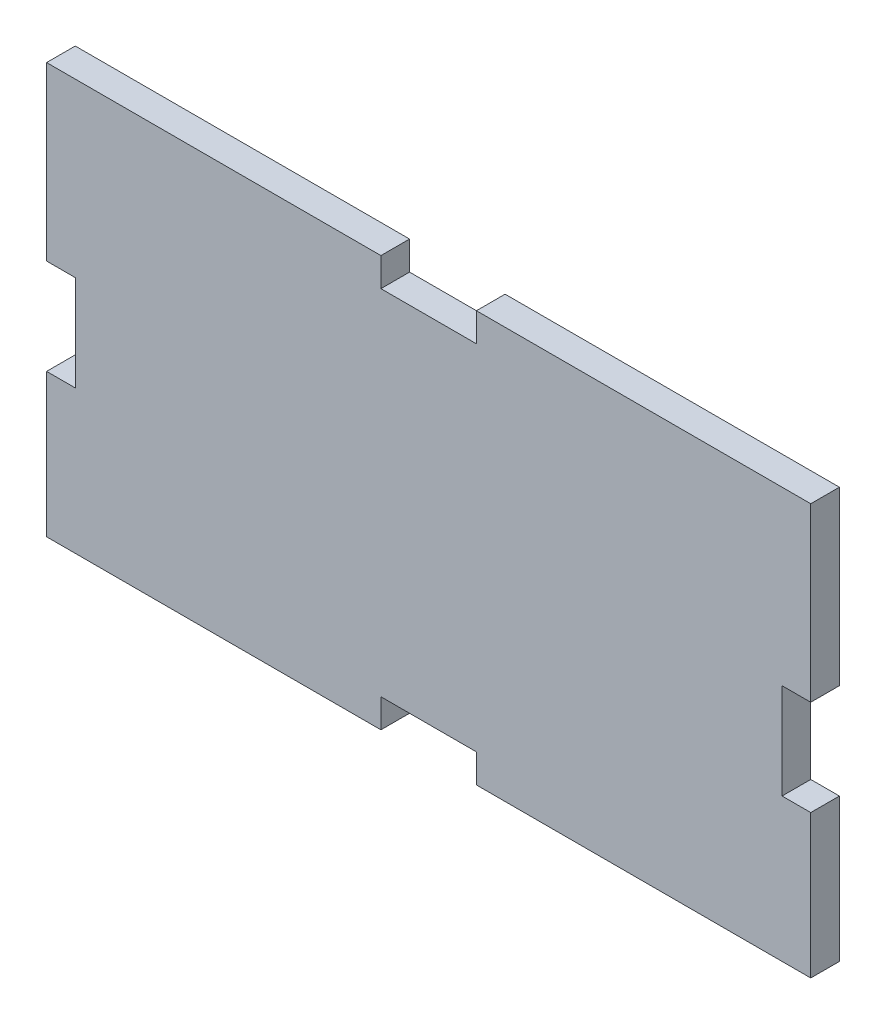
ISO-10303-21;
HEADER;
FILE_DESCRIPTION(('STEP AP214'),'2;1');
FILE_NAME('part.step','',(''),(''),'','','');
FILE_SCHEMA(('AUTOMOTIVE_DESIGN { 1 0 10303 214 1 1 1 1 }'));
ENDSEC;
DATA;
#1=APPLICATION_CONTEXT('core data for automotive mechanical design processes');
#2=APPLICATION_PROTOCOL_DEFINITION('international standard','automotive_design',2000,#1);
#3=PRODUCT_CONTEXT('',#1,'mechanical');
#4=PRODUCT('Part','Part','',(#3));
#5=PRODUCT_RELATED_PRODUCT_CATEGORY('part','',(#4));
#6=PRODUCT_DEFINITION_FORMATION('','',#4);
#7=PRODUCT_DEFINITION_CONTEXT('part definition',#1,'design');
#8=PRODUCT_DEFINITION('design','',#6,#7);
#9=PRODUCT_DEFINITION_SHAPE('','',#8);
#10=(LENGTH_UNIT() NAMED_UNIT(*) SI_UNIT(.MILLI.,.METRE.));
#11=(NAMED_UNIT(*) PLANE_ANGLE_UNIT() SI_UNIT($,.RADIAN.));
#12=(NAMED_UNIT(*) SI_UNIT($,.STERADIAN.) SOLID_ANGLE_UNIT());
#13=UNCERTAINTY_MEASURE_WITH_UNIT(LENGTH_MEASURE(1.E-05),#10,'distance_accuracy_value','');
#14=(GEOMETRIC_REPRESENTATION_CONTEXT(3) GLOBAL_UNCERTAINTY_ASSIGNED_CONTEXT((#13)) GLOBAL_UNIT_ASSIGNED_CONTEXT((#10,
#11,#12)) REPRESENTATION_CONTEXT('',''));
#15=CARTESIAN_POINT('',(0.,0.,0.));
#16=DIRECTION('',(0.,0.,1.));
#17=DIRECTION('',(1.,0.,0.));
#18=AXIS2_PLACEMENT_3D('',#15,#16,#17);
#19=CARTESIAN_POINT('',(-32.6435719058765,-2.13730942666412E-11,3.));
#20=DIRECTION('',(0.,-1.,0.));
#21=DIRECTION('',(0.,0.,-1.));
#22=AXIS2_PLACEMENT_3D('',#19,#20,#21);
#23=PLANE('',#22);
#24=DIRECTION('',(-1.,0.,0.));
#25=VECTOR('',#24,1.);
#26=CARTESIAN_POINT('',(-32.6435719058765,-2.13730942666412E-11,0.));
#27=LINE('',#26,#25);
#28=CARTESIAN_POINT('',(2.35642809412349,-2.13730942666412E-11,0.));
#29=VERTEX_POINT('',#28);
#30=CARTESIAN_POINT('',(-32.6435719058765,-2.13730942666412E-11,0.));
#31=VERTEX_POINT('',#30);
#32=EDGE_CURVE('E205',#29,#31,#27,.T.);
#33=ORIENTED_EDGE('',*,*,#32,.T.);
#34=DIRECTION('',(0.,0.,-1.));
#35=VECTOR('',#34,1.);
#36=CARTESIAN_POINT('',(-32.6435719058765,-2.13730942666412E-11,3.));
#37=LINE('',#36,#35);
#38=CARTESIAN_POINT('',(-32.6435719058765,-2.13730942666412E-11,3.));
#39=VERTEX_POINT('',#38);
#40=EDGE_CURVE('E11',#39,#31,#37,.T.);
#41=ORIENTED_EDGE('',*,*,#40,.F.);
#42=DIRECTION('',(-1.,0.,0.));
#43=VECTOR('',#42,1.);
#44=CARTESIAN_POINT('',(-32.6435719058765,-2.13730942666412E-11,3.));
#45=LINE('',#44,#43);
#46=CARTESIAN_POINT('',(2.35642809412349,-2.13730942666412E-11,3.));
#47=VERTEX_POINT('',#46);
#48=EDGE_CURVE('E244',#47,#39,#45,.T.);
#49=ORIENTED_EDGE('',*,*,#48,.F.);
#50=DIRECTION('',(0.,0.,-1.));
#51=VECTOR('',#50,1.);
#52=CARTESIAN_POINT('',(2.35642809412349,-2.13730942666412E-11,3.));
#53=LINE('',#52,#51);
#54=EDGE_CURVE('E201',#47,#29,#53,.T.);
#55=ORIENTED_EDGE('',*,*,#54,.T.);
#56=EDGE_LOOP('',(#33,#41,#49,#55));
#57=FACE_BOUND('',#56,.T.);
#58=ADVANCED_FACE('F37',(#57),#23,.F.);
#59=CARTESIAN_POINT('',(-32.6435719058765,-2.13730942666412E-11,3.));
#60=DIRECTION('',(1.,0.,0.));
#61=DIRECTION('',(0.,1.,0.));
#62=AXIS2_PLACEMENT_3D('',#59,#60,#61);
#63=PLANE('',#62);
#64=DIRECTION('',(0.,-1.,0.));
#65=VECTOR('',#64,1.);
#66=CARTESIAN_POINT('',(-32.6435719058765,-2.13730942666412E-11,0.));
#67=LINE('',#66,#65);
#68=CARTESIAN_POINT('',(-32.6435719058765,-18.0000000000214,0.));
#69=VERTEX_POINT('',#68);
#70=EDGE_CURVE('E208',#31,#69,#67,.T.);
#71=ORIENTED_EDGE('',*,*,#70,.T.);
#72=DIRECTION('',(0.,0.,-1.));
#73=VECTOR('',#72,1.);
#74=CARTESIAN_POINT('',(-32.6435719058765,-18.0000000000214,3.));
#75=LINE('',#74,#73);
#76=CARTESIAN_POINT('',(-32.6435719058765,-18.0000000000214,3.));
#77=VERTEX_POINT('',#76);
#78=EDGE_CURVE('E45',#77,#69,#75,.T.);
#79=ORIENTED_EDGE('',*,*,#78,.F.);
#80=DIRECTION('',(0.,-1.,0.));
#81=VECTOR('',#80,1.);
#82=CARTESIAN_POINT('',(-32.6435719058765,-2.13730942666412E-11,3.));
#83=LINE('',#82,#81);
#84=EDGE_CURVE('E132',#39,#77,#83,.T.);
#85=ORIENTED_EDGE('',*,*,#84,.F.);
#86=ORIENTED_EDGE('',*,*,#40,.T.);
#87=EDGE_LOOP('',(#71,#79,#85,#86));
#88=FACE_BOUND('',#87,.T.);
#89=ADVANCED_FACE('F361',(#88),#63,.F.);
#90=CARTESIAN_POINT('',(-32.6435719058765,-18.0000000000214,3.));
#91=DIRECTION('',(0.,1.,0.));
#92=DIRECTION('',(0.,0.,1.));
#93=AXIS2_PLACEMENT_3D('',#90,#91,#92);
#94=PLANE('',#93);
#95=DIRECTION('',(1.,0.,0.));
#96=VECTOR('',#95,1.);
#97=CARTESIAN_POINT('',(-32.6435719058765,-18.0000000000214,0.));
#98=LINE('',#97,#96);
#99=CARTESIAN_POINT('',(-29.6435719058765,-18.0000000000214,0.));
#100=VERTEX_POINT('',#99);
#101=EDGE_CURVE('E210',#69,#100,#98,.T.);
#102=ORIENTED_EDGE('',*,*,#101,.T.);
#103=DIRECTION('',(0.,0.,-1.));
#104=VECTOR('',#103,1.);
#105=CARTESIAN_POINT('',(-29.6435719058765,-18.0000000000214,3.));
#106=LINE('',#105,#104);
#107=CARTESIAN_POINT('',(-29.6435719058765,-18.0000000000214,3.));
#108=VERTEX_POINT('',#107);
#109=EDGE_CURVE('E287',#108,#100,#106,.T.);
#110=ORIENTED_EDGE('',*,*,#109,.F.);
#111=DIRECTION('',(1.,0.,0.));
#112=VECTOR('',#111,1.);
#113=CARTESIAN_POINT('',(-32.6435719058765,-18.0000000000214,3.));
#114=LINE('',#113,#112);
#115=EDGE_CURVE('E295',#77,#108,#114,.T.);
#116=ORIENTED_EDGE('',*,*,#115,.F.);
#117=ORIENTED_EDGE('',*,*,#78,.T.);
#118=EDGE_LOOP('',(#102,#110,#116,#117));
#119=FACE_BOUND('',#118,.T.);
#120=ADVANCED_FACE('F293',(#119),#94,.F.);
#121=CARTESIAN_POINT('',(-29.6435719058765,-18.0000000000214,3.));
#122=DIRECTION('',(1.,0.,0.));
#123=DIRECTION('',(0.,0.,-1.));
#124=AXIS2_PLACEMENT_3D('',#121,#122,#123);
#125=PLANE('',#124);
#126=DIRECTION('',(0.,-1.,0.));
#127=VECTOR('',#126,1.);
#128=CARTESIAN_POINT('',(-29.6435719058765,-18.0000000000214,0.));
#129=LINE('',#128,#127);
#130=CARTESIAN_POINT('',(-29.6435719058765,-28.0000000000214,0.));
#131=VERTEX_POINT('',#130);
#132=EDGE_CURVE('E212',#100,#131,#129,.T.);
#133=ORIENTED_EDGE('',*,*,#132,.T.);
#134=DIRECTION('',(0.,0.,-1.));
#135=VECTOR('',#134,1.);
#136=CARTESIAN_POINT('',(-29.6435719058765,-28.0000000000214,3.));
#137=LINE('',#136,#135);
#138=CARTESIAN_POINT('',(-29.6435719058765,-28.0000000000214,3.));
#139=VERTEX_POINT('',#138);
#140=EDGE_CURVE('E284',#139,#131,#137,.T.);
#141=ORIENTED_EDGE('',*,*,#140,.F.);
#142=DIRECTION('',(0.,-1.,0.));
#143=VECTOR('',#142,1.);
#144=CARTESIAN_POINT('',(-29.6435719058765,-18.0000000000214,3.));
#145=LINE('',#144,#143);
#146=EDGE_CURVE('E313',#108,#139,#145,.T.);
#147=ORIENTED_EDGE('',*,*,#146,.F.);
#148=ORIENTED_EDGE('',*,*,#109,.T.);
#149=EDGE_LOOP('',(#133,#141,#147,#148));
#150=FACE_BOUND('',#149,.T.);
#151=ADVANCED_FACE('F304',(#150),#125,.F.);
#152=CARTESIAN_POINT('',(-29.6435719058765,-28.0000000000214,3.));
#153=DIRECTION('',(0.,-1.,0.));
#154=DIRECTION('',(0.,0.,-1.));
#155=AXIS2_PLACEMENT_3D('',#152,#153,#154);
#156=PLANE('',#155);
#157=DIRECTION('',(-1.,0.,0.));
#158=VECTOR('',#157,1.);
#159=CARTESIAN_POINT('',(-29.6435719058765,-28.0000000000214,0.));
#160=LINE('',#159,#158);
#161=CARTESIAN_POINT('',(-32.6435719058765,-28.0000000000214,0.));
#162=VERTEX_POINT('',#161);
#163=EDGE_CURVE('E214',#131,#162,#160,.T.);
#164=ORIENTED_EDGE('',*,*,#163,.T.);
#165=DIRECTION('',(0.,0.,-1.));
#166=VECTOR('',#165,1.);
#167=CARTESIAN_POINT('',(-32.6435719058765,-28.0000000000214,3.));
#168=LINE('',#167,#166);
#169=CARTESIAN_POINT('',(-32.6435719058765,-28.0000000000214,3.));
#170=VERTEX_POINT('',#169);
#171=EDGE_CURVE('E281',#170,#162,#168,.T.);
#172=ORIENTED_EDGE('',*,*,#171,.F.);
#173=DIRECTION('',(-1.,0.,0.));
#174=VECTOR('',#173,1.);
#175=CARTESIAN_POINT('',(-29.6435719058765,-28.0000000000214,3.));
#176=LINE('',#175,#174);
#177=EDGE_CURVE('E310',#139,#170,#176,.T.);
#178=ORIENTED_EDGE('',*,*,#177,.F.);
#179=ORIENTED_EDGE('',*,*,#140,.T.);
#180=EDGE_LOOP('',(#164,#172,#178,#179));
#181=FACE_BOUND('',#180,.T.);
#182=ADVANCED_FACE('F308',(#181),#156,.F.);
#183=CARTESIAN_POINT('',(-32.6435719058765,-28.0000000000214,3.));
#184=DIRECTION('',(1.,0.,0.));
#185=DIRECTION('',(0.,0.,-1.));
#186=AXIS2_PLACEMENT_3D('',#183,#184,#185);
#187=PLANE('',#186);
#188=DIRECTION('',(0.,-1.,0.));
#189=VECTOR('',#188,1.);
#190=CARTESIAN_POINT('',(-32.6435719058765,-28.0000000000214,0.));
#191=LINE('',#190,#189);
#192=CARTESIAN_POINT('',(-32.6435719058765,-43.0000000000214,0.));
#193=VERTEX_POINT('',#192);
#194=EDGE_CURVE('E216',#162,#193,#191,.T.);
#195=ORIENTED_EDGE('',*,*,#194,.T.);
#196=DIRECTION('',(0.,0.,-1.));
#197=VECTOR('',#196,1.);
#198=CARTESIAN_POINT('',(-32.6435719058765,-43.0000000000214,3.));
#199=LINE('',#198,#197);
#200=CARTESIAN_POINT('',(-32.6435719058765,-43.0000000000214,3.));
#201=VERTEX_POINT('',#200);
#202=EDGE_CURVE('E278',#201,#193,#199,.T.);
#203=ORIENTED_EDGE('',*,*,#202,.F.);
#204=DIRECTION('',(0.,-1.,0.));
#205=VECTOR('',#204,1.);
#206=CARTESIAN_POINT('',(-32.6435719058765,-28.0000000000214,3.));
#207=LINE('',#206,#205);
#208=EDGE_CURVE('E312',#170,#201,#207,.T.);
#209=ORIENTED_EDGE('',*,*,#208,.F.);
#210=ORIENTED_EDGE('',*,*,#171,.T.);
#211=EDGE_LOOP('',(#195,#203,#209,#210));
#212=FACE_BOUND('',#211,.T.);
#213=ADVANCED_FACE('F374',(#212),#187,.F.);
#214=CARTESIAN_POINT('',(-32.6435719058765,-43.0000000000214,3.));
#215=DIRECTION('',(0.,1.,0.));
#216=DIRECTION('',(0.,0.,1.));
#217=AXIS2_PLACEMENT_3D('',#214,#215,#216);
#218=PLANE('',#217);
#219=DIRECTION('',(1.,0.,0.));
#220=VECTOR('',#219,1.);
#221=CARTESIAN_POINT('',(-32.6435719058765,-43.0000000000214,0.));
#222=LINE('',#221,#220);
#223=CARTESIAN_POINT('',(2.35642809412349,-43.0000000000214,0.));
#224=VERTEX_POINT('',#223);
#225=EDGE_CURVE('E218',#193,#224,#222,.T.);
#226=ORIENTED_EDGE('',*,*,#225,.T.);
#227=DIRECTION('',(0.,0.,-1.));
#228=VECTOR('',#227,1.);
#229=CARTESIAN_POINT('',(2.35642809412349,-43.0000000000214,3.));
#230=LINE('',#229,#228);
#231=CARTESIAN_POINT('',(2.35642809412349,-43.0000000000214,3.));
#232=VERTEX_POINT('',#231);
#233=EDGE_CURVE('E275',#232,#224,#230,.T.);
#234=ORIENTED_EDGE('',*,*,#233,.F.);
#235=DIRECTION('',(1.,0.,0.));
#236=VECTOR('',#235,1.);
#237=CARTESIAN_POINT('',(-32.6435719058765,-43.0000000000214,3.));
#238=LINE('',#237,#236);
#239=EDGE_CURVE('E315',#201,#232,#238,.T.);
#240=ORIENTED_EDGE('',*,*,#239,.F.);
#241=ORIENTED_EDGE('',*,*,#202,.T.);
#242=EDGE_LOOP('',(#226,#234,#240,#241));
#243=FACE_BOUND('',#242,.T.);
#244=ADVANCED_FACE('F377',(#243),#218,.F.);
#245=CARTESIAN_POINT('',(2.35642809412349,-43.0000000000214,3.));
#246=DIRECTION('',(-1.,0.,0.));
#247=DIRECTION('',(0.,-1.,0.));
#248=AXIS2_PLACEMENT_3D('',#245,#246,#247);
#249=PLANE('',#248);
#250=DIRECTION('',(0.,1.,0.));
#251=VECTOR('',#250,1.);
#252=CARTESIAN_POINT('',(2.35642809412349,-43.0000000000214,0.));
#253=LINE('',#252,#251);
#254=CARTESIAN_POINT('',(2.35642809412349,-40.0000000000214,0.));
#255=VERTEX_POINT('',#254);
#256=EDGE_CURVE('E220',#224,#255,#253,.T.);
#257=ORIENTED_EDGE('',*,*,#256,.T.);
#258=DIRECTION('',(0.,0.,-1.));
#259=VECTOR('',#258,1.);
#260=CARTESIAN_POINT('',(2.35642809412349,-40.0000000000214,3.));
#261=LINE('',#260,#259);
#262=CARTESIAN_POINT('',(2.35642809412349,-40.0000000000214,3.));
#263=VERTEX_POINT('',#262);
#264=EDGE_CURVE('E272',#263,#255,#261,.T.);
#265=ORIENTED_EDGE('',*,*,#264,.F.);
#266=DIRECTION('',(0.,1.,0.));
#267=VECTOR('',#266,1.);
#268=CARTESIAN_POINT('',(2.35642809412349,-43.0000000000214,3.));
#269=LINE('',#268,#267);
#270=EDGE_CURVE('E321',#232,#263,#269,.T.);
#271=ORIENTED_EDGE('',*,*,#270,.F.);
#272=ORIENTED_EDGE('',*,*,#233,.T.);
#273=EDGE_LOOP('',(#257,#265,#271,#272));
#274=FACE_BOUND('',#273,.T.);
#275=ADVANCED_FACE('F381',(#274),#249,.F.);
#276=CARTESIAN_POINT('',(2.35642809412349,-40.0000000000214,3.));
#277=DIRECTION('',(0.,1.,0.));
#278=DIRECTION('',(0.,0.,1.));
#279=AXIS2_PLACEMENT_3D('',#276,#277,#278);
#280=PLANE('',#279);
#281=DIRECTION('',(1.,0.,0.));
#282=VECTOR('',#281,1.);
#283=CARTESIAN_POINT('',(2.35642809412349,-40.0000000000214,0.));
#284=LINE('',#283,#282);
#285=CARTESIAN_POINT('',(12.3564280941235,-40.0000000000214,0.));
#286=VERTEX_POINT('',#285);
#287=EDGE_CURVE('E222',#255,#286,#284,.T.);
#288=ORIENTED_EDGE('',*,*,#287,.T.);
#289=DIRECTION('',(0.,0.,-1.));
#290=VECTOR('',#289,1.);
#291=CARTESIAN_POINT('',(12.3564280941235,-40.0000000000214,3.));
#292=LINE('',#291,#290);
#293=CARTESIAN_POINT('',(12.3564280941235,-40.0000000000214,3.));
#294=VERTEX_POINT('',#293);
#295=EDGE_CURVE('E269',#294,#286,#292,.T.);
#296=ORIENTED_EDGE('',*,*,#295,.F.);
#297=DIRECTION('',(1.,0.,0.));
#298=VECTOR('',#297,1.);
#299=CARTESIAN_POINT('',(2.35642809412349,-40.0000000000214,3.));
#300=LINE('',#299,#298);
#301=EDGE_CURVE('E323',#263,#294,#300,.T.);
#302=ORIENTED_EDGE('',*,*,#301,.F.);
#303=ORIENTED_EDGE('',*,*,#264,.T.);
#304=EDGE_LOOP('',(#288,#296,#302,#303));
#305=FACE_BOUND('',#304,.T.);
#306=ADVANCED_FACE('F385',(#305),#280,.F.);
#307=CARTESIAN_POINT('',(12.3564280941235,-43.0000000000214,3.));
#308=DIRECTION('',(1.,0.,0.));
#309=DIRECTION('',(0.,1.,0.));
#310=AXIS2_PLACEMENT_3D('',#307,#308,#309);
#311=PLANE('',#310);
#312=DIRECTION('',(0.,-1.,0.));
#313=VECTOR('',#312,1.);
#314=CARTESIAN_POINT('',(12.3564280941235,-43.0000000000214,0.));
#315=LINE('',#314,#313);
#316=CARTESIAN_POINT('',(12.3564280941235,-43.0000000000214,0.));
#317=VERTEX_POINT('',#316);
#318=EDGE_CURVE('E224',#286,#317,#315,.T.);
#319=ORIENTED_EDGE('',*,*,#318,.T.);
#320=DIRECTION('',(0.,0.,-1.));
#321=VECTOR('',#320,1.);
#322=CARTESIAN_POINT('',(12.3564280941235,-43.0000000000214,3.));
#323=LINE('',#322,#321);
#324=CARTESIAN_POINT('',(12.3564280941235,-43.0000000000214,3.));
#325=VERTEX_POINT('',#324);
#326=EDGE_CURVE('E266',#325,#317,#323,.T.);
#327=ORIENTED_EDGE('',*,*,#326,.F.);
#328=DIRECTION('',(0.,-1.,0.));
#329=VECTOR('',#328,1.);
#330=CARTESIAN_POINT('',(12.3564280941235,-43.0000000000214,3.));
#331=LINE('',#330,#329);
#332=EDGE_CURVE('E325',#294,#325,#331,.T.);
#333=ORIENTED_EDGE('',*,*,#332,.F.);
#334=ORIENTED_EDGE('',*,*,#295,.T.);
#335=EDGE_LOOP('',(#319,#327,#333,#334));
#336=FACE_BOUND('',#335,.T.);
#337=ADVANCED_FACE('F389',(#336),#311,.F.);
#338=CARTESIAN_POINT('',(12.3564280941235,-43.0000000000214,3.));
#339=DIRECTION('',(0.,1.,0.));
#340=DIRECTION('',(0.,0.,1.));
#341=AXIS2_PLACEMENT_3D('',#338,#339,#340);
#342=PLANE('',#341);
#343=DIRECTION('',(1.,0.,0.));
#344=VECTOR('',#343,1.);
#345=CARTESIAN_POINT('',(12.3564280941235,-43.0000000000214,0.));
#346=LINE('',#345,#344);
#347=CARTESIAN_POINT('',(47.3564280941235,-43.0000000000214,0.));
#348=VERTEX_POINT('',#347);
#349=EDGE_CURVE('E226',#317,#348,#346,.T.);
#350=ORIENTED_EDGE('',*,*,#349,.T.);
#351=DIRECTION('',(0.,0.,-1.));
#352=VECTOR('',#351,1.);
#353=CARTESIAN_POINT('',(47.3564280941235,-43.0000000000214,3.));
#354=LINE('',#353,#352);
#355=CARTESIAN_POINT('',(47.3564280941235,-43.0000000000214,3.));
#356=VERTEX_POINT('',#355);
#357=EDGE_CURVE('E263',#356,#348,#354,.T.);
#358=ORIENTED_EDGE('',*,*,#357,.F.);
#359=DIRECTION('',(1.,0.,0.));
#360=VECTOR('',#359,1.);
#361=CARTESIAN_POINT('',(12.3564280941235,-43.0000000000214,3.));
#362=LINE('',#361,#360);
#363=EDGE_CURVE('E327',#325,#356,#362,.T.);
#364=ORIENTED_EDGE('',*,*,#363,.F.);
#365=ORIENTED_EDGE('',*,*,#326,.T.);
#366=EDGE_LOOP('',(#350,#358,#364,#365));
#367=FACE_BOUND('',#366,.T.);
#368=ADVANCED_FACE('F393',(#367),#342,.F.);
#369=CARTESIAN_POINT('',(47.3564280941235,-43.0000000000214,3.));
#370=DIRECTION('',(-1.,0.,0.));
#371=DIRECTION('',(0.,0.,1.));
#372=AXIS2_PLACEMENT_3D('',#369,#370,#371);
#373=PLANE('',#372);
#374=DIRECTION('',(0.,1.,0.));
#375=VECTOR('',#374,1.);
#376=CARTESIAN_POINT('',(47.3564280941235,-43.0000000000214,0.));
#377=LINE('',#376,#375);
#378=CARTESIAN_POINT('',(47.3564280941235,-28.0000000000214,0.));
#379=VERTEX_POINT('',#378);
#380=EDGE_CURVE('E228',#348,#379,#377,.T.);
#381=ORIENTED_EDGE('',*,*,#380,.T.);
#382=DIRECTION('',(0.,0.,-1.));
#383=VECTOR('',#382,1.);
#384=CARTESIAN_POINT('',(47.3564280941235,-28.0000000000214,3.));
#385=LINE('',#384,#383);
#386=CARTESIAN_POINT('',(47.3564280941235,-28.0000000000214,3.));
#387=VERTEX_POINT('',#386);
#388=EDGE_CURVE('E260',#387,#379,#385,.T.);
#389=ORIENTED_EDGE('',*,*,#388,.F.);
#390=DIRECTION('',(0.,1.,0.));
#391=VECTOR('',#390,1.);
#392=CARTESIAN_POINT('',(47.3564280941235,-43.0000000000214,3.));
#393=LINE('',#392,#391);
#394=EDGE_CURVE('E329',#356,#387,#393,.T.);
#395=ORIENTED_EDGE('',*,*,#394,.F.);
#396=ORIENTED_EDGE('',*,*,#357,.T.);
#397=EDGE_LOOP('',(#381,#389,#395,#396));
#398=FACE_BOUND('',#397,.T.);
#399=ADVANCED_FACE('F397',(#398),#373,.F.);
#400=CARTESIAN_POINT('',(47.3564280941235,-28.0000000000214,3.));
#401=DIRECTION('',(0.,-1.,0.));
#402=DIRECTION('',(0.,0.,-1.));
#403=AXIS2_PLACEMENT_3D('',#400,#401,#402);
#404=PLANE('',#403);
#405=DIRECTION('',(-1.,0.,0.));
#406=VECTOR('',#405,1.);
#407=CARTESIAN_POINT('',(47.3564280941235,-28.0000000000214,0.));
#408=LINE('',#407,#406);
#409=CARTESIAN_POINT('',(44.3564280941235,-28.0000000000214,0.));
#410=VERTEX_POINT('',#409);
#411=EDGE_CURVE('E230',#379,#410,#408,.T.);
#412=ORIENTED_EDGE('',*,*,#411,.T.);
#413=DIRECTION('',(0.,0.,-1.));
#414=VECTOR('',#413,1.);
#415=CARTESIAN_POINT('',(44.3564280941235,-28.0000000000214,3.));
#416=LINE('',#415,#414);
#417=CARTESIAN_POINT('',(44.3564280941235,-28.0000000000214,3.));
#418=VERTEX_POINT('',#417);
#419=EDGE_CURVE('E257',#418,#410,#416,.T.);
#420=ORIENTED_EDGE('',*,*,#419,.F.);
#421=DIRECTION('',(-1.,0.,0.));
#422=VECTOR('',#421,1.);
#423=CARTESIAN_POINT('',(47.3564280941235,-28.0000000000214,3.));
#424=LINE('',#423,#422);
#425=EDGE_CURVE('E331',#387,#418,#424,.T.);
#426=ORIENTED_EDGE('',*,*,#425,.F.);
#427=ORIENTED_EDGE('',*,*,#388,.T.);
#428=EDGE_LOOP('',(#412,#420,#426,#427));
#429=FACE_BOUND('',#428,.T.);
#430=ADVANCED_FACE('F401',(#429),#404,.F.);
#431=CARTESIAN_POINT('',(44.3564280941235,-28.0000000000214,3.));
#432=DIRECTION('',(-1.,0.,0.));
#433=DIRECTION('',(0.,0.,1.));
#434=AXIS2_PLACEMENT_3D('',#431,#432,#433);
#435=PLANE('',#434);
#436=DIRECTION('',(0.,1.,0.));
#437=VECTOR('',#436,1.);
#438=CARTESIAN_POINT('',(44.3564280941235,-28.0000000000214,0.));
#439=LINE('',#438,#437);
#440=CARTESIAN_POINT('',(44.3564280941235,-18.0000000000214,0.));
#441=VERTEX_POINT('',#440);
#442=EDGE_CURVE('E232',#410,#441,#439,.T.);
#443=ORIENTED_EDGE('',*,*,#442,.T.);
#444=DIRECTION('',(0.,0.,-1.));
#445=VECTOR('',#444,1.);
#446=CARTESIAN_POINT('',(44.3564280941235,-18.0000000000214,3.));
#447=LINE('',#446,#445);
#448=CARTESIAN_POINT('',(44.3564280941235,-18.0000000000214,3.));
#449=VERTEX_POINT('',#448);
#450=EDGE_CURVE('E254',#449,#441,#447,.T.);
#451=ORIENTED_EDGE('',*,*,#450,.F.);
#452=DIRECTION('',(0.,1.,0.));
#453=VECTOR('',#452,1.);
#454=CARTESIAN_POINT('',(44.3564280941235,-28.0000000000214,3.));
#455=LINE('',#454,#453);
#456=EDGE_CURVE('E333',#418,#449,#455,.T.);
#457=ORIENTED_EDGE('',*,*,#456,.F.);
#458=ORIENTED_EDGE('',*,*,#419,.T.);
#459=EDGE_LOOP('',(#443,#451,#457,#458));
#460=FACE_BOUND('',#459,.T.);
#461=ADVANCED_FACE('F405',(#460),#435,.F.);
#462=CARTESIAN_POINT('',(44.3564280941235,-18.0000000000214,3.));
#463=DIRECTION('',(0.,1.,0.));
#464=DIRECTION('',(0.,0.,1.));
#465=AXIS2_PLACEMENT_3D('',#462,#463,#464);
#466=PLANE('',#465);
#467=DIRECTION('',(1.,0.,0.));
#468=VECTOR('',#467,1.);
#469=CARTESIAN_POINT('',(44.3564280941235,-18.0000000000214,0.));
#470=LINE('',#469,#468);
#471=CARTESIAN_POINT('',(47.3564280941235,-18.0000000000214,0.));
#472=VERTEX_POINT('',#471);
#473=EDGE_CURVE('E234',#441,#472,#470,.T.);
#474=ORIENTED_EDGE('',*,*,#473,.T.);
#475=DIRECTION('',(0.,0.,-1.));
#476=VECTOR('',#475,1.);
#477=CARTESIAN_POINT('',(47.3564280941235,-18.0000000000214,3.));
#478=LINE('',#477,#476);
#479=CARTESIAN_POINT('',(47.3564280941235,-18.0000000000214,3.));
#480=VERTEX_POINT('',#479);
#481=EDGE_CURVE('E251',#480,#472,#478,.T.);
#482=ORIENTED_EDGE('',*,*,#481,.F.);
#483=DIRECTION('',(1.,0.,0.));
#484=VECTOR('',#483,1.);
#485=CARTESIAN_POINT('',(44.3564280941235,-18.0000000000214,3.));
#486=LINE('',#485,#484);
#487=EDGE_CURVE('E335',#449,#480,#486,.T.);
#488=ORIENTED_EDGE('',*,*,#487,.F.);
#489=ORIENTED_EDGE('',*,*,#450,.T.);
#490=EDGE_LOOP('',(#474,#482,#488,#489));
#491=FACE_BOUND('',#490,.T.);
#492=ADVANCED_FACE('F409',(#491),#466,.F.);
#493=CARTESIAN_POINT('',(47.3564280941235,-2.13730942666412E-11,3.));
#494=DIRECTION('',(-1.,0.,0.));
#495=DIRECTION('',(0.,0.,1.));
#496=AXIS2_PLACEMENT_3D('',#493,#494,#495);
#497=PLANE('',#496);
#498=DIRECTION('',(0.,1.,0.));
#499=VECTOR('',#498,1.);
#500=CARTESIAN_POINT('',(47.3564280941235,-2.13730942666412E-11,0.));
#501=LINE('',#500,#499);
#502=CARTESIAN_POINT('',(47.3564280941235,-2.13730942666412E-11,0.));
#503=VERTEX_POINT('',#502);
#504=EDGE_CURVE('E237',#472,#503,#501,.T.);
#505=ORIENTED_EDGE('',*,*,#504,.T.);
#506=DIRECTION('',(0.,0.,-1.));
#507=VECTOR('',#506,1.);
#508=CARTESIAN_POINT('',(47.3564280941235,-2.13730942666412E-11,3.));
#509=LINE('',#508,#507);
#510=CARTESIAN_POINT('',(47.3564280941235,-2.13730942666412E-11,3.));
#511=VERTEX_POINT('',#510);
#512=EDGE_CURVE('E248',#511,#503,#509,.T.);
#513=ORIENTED_EDGE('',*,*,#512,.F.);
#514=DIRECTION('',(0.,1.,0.));
#515=VECTOR('',#514,1.);
#516=CARTESIAN_POINT('',(47.3564280941235,-18.0000000000214,3.));
#517=LINE('',#516,#515);
#518=EDGE_CURVE('E337',#480,#511,#517,.T.);
#519=ORIENTED_EDGE('',*,*,#518,.F.);
#520=ORIENTED_EDGE('',*,*,#481,.T.);
#521=EDGE_LOOP('',(#505,#513,#519,#520));
#522=FACE_BOUND('',#521,.T.);
#523=ADVANCED_FACE('F343',(#522),#497,.F.);
#524=CARTESIAN_POINT('',(12.3564280941235,-2.13730942666412E-11,3.));
#525=DIRECTION('',(0.,-1.,0.));
#526=DIRECTION('',(0.,0.,-1.));
#527=AXIS2_PLACEMENT_3D('',#524,#525,#526);
#528=PLANE('',#527);
#529=DIRECTION('',(-1.,0.,0.));
#530=VECTOR('',#529,1.);
#531=CARTESIAN_POINT('',(12.3564280941235,-2.13730942666412E-11,0.));
#532=LINE('',#531,#530);
#533=CARTESIAN_POINT('',(12.3564280941235,-2.13730942666412E-11,0.));
#534=VERTEX_POINT('',#533);
#535=EDGE_CURVE('E239',#503,#534,#532,.T.);
#536=ORIENTED_EDGE('',*,*,#535,.T.);
#537=DIRECTION('',(0.,0.,-1.));
#538=VECTOR('',#537,1.);
#539=CARTESIAN_POINT('',(12.3564280941235,-2.13730942666412E-11,3.));
#540=LINE('',#539,#538);
#541=CARTESIAN_POINT('',(12.3564280941235,-2.13730942666412E-11,3.));
#542=VERTEX_POINT('',#541);
#543=EDGE_CURVE('E196',#542,#534,#540,.T.);
#544=ORIENTED_EDGE('',*,*,#543,.F.);
#545=DIRECTION('',(-1.,0.,0.));
#546=VECTOR('',#545,1.);
#547=CARTESIAN_POINT('',(12.3564280941235,-2.13730942666412E-11,3.));
#548=LINE('',#547,#546);
#549=EDGE_CURVE('E187',#511,#542,#548,.T.);
#550=ORIENTED_EDGE('',*,*,#549,.F.);
#551=ORIENTED_EDGE('',*,*,#512,.T.);
#552=EDGE_LOOP('',(#536,#544,#550,#551));
#553=FACE_BOUND('',#552,.T.);
#554=ADVANCED_FACE('F346',(#553),#528,.F.);
#555=CARTESIAN_POINT('',(12.3564280941235,-3.00000000002137,3.));
#556=DIRECTION('',(1.,0.,0.));
#557=DIRECTION('',(0.,1.,0.));
#558=AXIS2_PLACEMENT_3D('',#555,#556,#557);
#559=PLANE('',#558);
#560=DIRECTION('',(0.,-1.,0.));
#561=VECTOR('',#560,1.);
#562=CARTESIAN_POINT('',(12.3564280941235,-3.00000000002137,0.));
#563=LINE('',#562,#561);
#564=CARTESIAN_POINT('',(12.3564280941235,-3.00000000002137,0.));
#565=VERTEX_POINT('',#564);
#566=EDGE_CURVE('E195',#534,#565,#563,.T.);
#567=ORIENTED_EDGE('',*,*,#566,.T.);
#568=DIRECTION('',(0.,0.,-1.));
#569=VECTOR('',#568,1.);
#570=CARTESIAN_POINT('',(12.3564280941235,-3.00000000002137,3.));
#571=LINE('',#570,#569);
#572=CARTESIAN_POINT('',(12.3564280941235,-3.00000000002137,3.));
#573=VERTEX_POINT('',#572);
#574=EDGE_CURVE('E192',#573,#565,#571,.T.);
#575=ORIENTED_EDGE('',*,*,#574,.F.);
#576=DIRECTION('',(0.,-1.,0.));
#577=VECTOR('',#576,1.);
#578=CARTESIAN_POINT('',(12.3564280941235,-3.00000000002137,3.));
#579=LINE('',#578,#577);
#580=EDGE_CURVE('E181',#542,#573,#579,.T.);
#581=ORIENTED_EDGE('',*,*,#580,.F.);
#582=ORIENTED_EDGE('',*,*,#543,.T.);
#583=EDGE_LOOP('',(#567,#575,#581,#582));
#584=FACE_BOUND('',#583,.T.);
#585=ADVANCED_FACE('F193',(#584),#559,.F.);
#586=CARTESIAN_POINT('',(2.35642809412349,-3.00000000002137,3.));
#587=DIRECTION('',(0.,-1.,0.));
#588=DIRECTION('',(0.,0.,-1.));
#589=AXIS2_PLACEMENT_3D('',#586,#587,#588);
#590=PLANE('',#589);
#591=DIRECTION('',(-1.,0.,0.));
#592=VECTOR('',#591,1.);
#593=CARTESIAN_POINT('',(2.35642809412349,-3.00000000002137,0.));
#594=LINE('',#593,#592);
#595=CARTESIAN_POINT('',(2.35642809412349,-3.00000000002137,0.));
#596=VERTEX_POINT('',#595);
#597=EDGE_CURVE('E118',#565,#596,#594,.T.);
#598=ORIENTED_EDGE('',*,*,#597,.T.);
#599=DIRECTION('',(0.,0.,-1.));
#600=VECTOR('',#599,1.);
#601=CARTESIAN_POINT('',(2.35642809412349,-3.00000000002137,3.));
#602=LINE('',#601,#600);
#603=CARTESIAN_POINT('',(2.35642809412349,-3.00000000002137,3.));
#604=VERTEX_POINT('',#603);
#605=EDGE_CURVE('E197',#604,#596,#602,.T.);
#606=ORIENTED_EDGE('',*,*,#605,.F.);
#607=DIRECTION('',(-1.,0.,0.));
#608=VECTOR('',#607,1.);
#609=CARTESIAN_POINT('',(2.35642809412349,-3.00000000002137,3.));
#610=LINE('',#609,#608);
#611=EDGE_CURVE('E185',#573,#604,#610,.T.);
#612=ORIENTED_EDGE('',*,*,#611,.F.);
#613=ORIENTED_EDGE('',*,*,#574,.T.);
#614=EDGE_LOOP('',(#598,#606,#612,#613));
#615=FACE_BOUND('',#614,.T.);
#616=ADVANCED_FACE('F199',(#615),#590,.F.);
#617=CARTESIAN_POINT('',(2.35642809412349,-2.13730942666412E-11,3.));
#618=DIRECTION('',(-1.,0.,0.));
#619=DIRECTION('',(0.,0.,1.));
#620=AXIS2_PLACEMENT_3D('',#617,#618,#619);
#621=PLANE('',#620);
#622=DIRECTION('',(0.,1.,0.));
#623=VECTOR('',#622,1.);
#624=CARTESIAN_POINT('',(2.35642809412349,-2.13730942666412E-11,0.));
#625=LINE('',#624,#623);
#626=EDGE_CURVE('E124',#596,#29,#625,.T.);
#627=ORIENTED_EDGE('',*,*,#626,.T.);
#628=ORIENTED_EDGE('',*,*,#54,.F.);
#629=DIRECTION('',(0.,1.,0.));
#630=VECTOR('',#629,1.);
#631=CARTESIAN_POINT('',(2.35642809412349,-2.13730942666412E-11,3.));
#632=LINE('',#631,#630);
#633=EDGE_CURVE('E53',#604,#47,#632,.T.);
#634=ORIENTED_EDGE('',*,*,#633,.F.);
#635=ORIENTED_EDGE('',*,*,#605,.T.);
#636=EDGE_LOOP('',(#627,#628,#634,#635));
#637=FACE_BOUND('',#636,.T.);
#638=ADVANCED_FACE('F350',(#637),#621,.F.);
#639=CARTESIAN_POINT('',(0.,0.,3.));
#640=DIRECTION('',(0.,0.,-1.));
#641=DIRECTION('',(-1.,0.,0.));
#642=AXIS2_PLACEMENT_3D('',#639,#640,#641);
#643=PLANE('',#642);
#644=ORIENTED_EDGE('',*,*,#48,.T.);
#645=ORIENTED_EDGE('',*,*,#84,.T.);
#646=ORIENTED_EDGE('',*,*,#115,.T.);
#647=ORIENTED_EDGE('',*,*,#146,.T.);
#648=ORIENTED_EDGE('',*,*,#177,.T.);
#649=ORIENTED_EDGE('',*,*,#208,.T.);
#650=ORIENTED_EDGE('',*,*,#239,.T.);
#651=ORIENTED_EDGE('',*,*,#270,.T.);
#652=ORIENTED_EDGE('',*,*,#301,.T.);
#653=ORIENTED_EDGE('',*,*,#332,.T.);
#654=ORIENTED_EDGE('',*,*,#363,.T.);
#655=ORIENTED_EDGE('',*,*,#394,.T.);
#656=ORIENTED_EDGE('',*,*,#425,.T.);
#657=ORIENTED_EDGE('',*,*,#456,.T.);
#658=ORIENTED_EDGE('',*,*,#487,.T.);
#659=ORIENTED_EDGE('',*,*,#518,.T.);
#660=ORIENTED_EDGE('',*,*,#549,.T.);
#661=ORIENTED_EDGE('',*,*,#580,.T.);
#662=ORIENTED_EDGE('',*,*,#611,.T.);
#663=ORIENTED_EDGE('',*,*,#633,.T.);
#664=EDGE_LOOP('',(#644,#645,#646,#647,#648,#649,#650,#651,#652,#653,#654,#655,#656,#657,#658,
#659,#660,#661,#662,#663));
#665=FACE_BOUND('',#664,.T.);
#666=ADVANCED_FACE('F183',(#665),#643,.F.);
#667=CARTESIAN_POINT('',(0.,0.,0.));
#668=DIRECTION('',(0.,0.,-1.));
#669=DIRECTION('',(-1.,0.,0.));
#670=AXIS2_PLACEMENT_3D('',#667,#668,#669);
#671=PLANE('',#670);
#672=ORIENTED_EDGE('',*,*,#32,.F.);
#673=ORIENTED_EDGE('',*,*,#626,.F.);
#674=ORIENTED_EDGE('',*,*,#597,.F.);
#675=ORIENTED_EDGE('',*,*,#566,.F.);
#676=ORIENTED_EDGE('',*,*,#535,.F.);
#677=ORIENTED_EDGE('',*,*,#504,.F.);
#678=ORIENTED_EDGE('',*,*,#473,.F.);
#679=ORIENTED_EDGE('',*,*,#442,.F.);
#680=ORIENTED_EDGE('',*,*,#411,.F.);
#681=ORIENTED_EDGE('',*,*,#380,.F.);
#682=ORIENTED_EDGE('',*,*,#349,.F.);
#683=ORIENTED_EDGE('',*,*,#318,.F.);
#684=ORIENTED_EDGE('',*,*,#287,.F.);
#685=ORIENTED_EDGE('',*,*,#256,.F.);
#686=ORIENTED_EDGE('',*,*,#225,.F.);
#687=ORIENTED_EDGE('',*,*,#194,.F.);
#688=ORIENTED_EDGE('',*,*,#163,.F.);
#689=ORIENTED_EDGE('',*,*,#132,.F.);
#690=ORIENTED_EDGE('',*,*,#101,.F.);
#691=ORIENTED_EDGE('',*,*,#70,.F.);
#692=EDGE_LOOP('',(#672,#673,#674,#675,#676,#677,#678,#679,#680,#681,#682,#683,#684,#685,#686,
#687,#688,#689,#690,#691));
#693=FACE_BOUND('',#692,.T.);
#694=ADVANCED_FACE('F299',(#693),#671,.T.);
#695=CLOSED_SHELL('',(#58,#89,#120,#151,#182,#213,#244,#275,#306,#337,#368,#399,#430,#461,#492,
#523,#554,#585,#616,#638,#666,#694));
#696=MANIFOLD_SOLID_BREP('B2',#695);
#697=ADVANCED_BREP_SHAPE_REPRESENTATION('',(#18,#696),#14);
#698=SHAPE_DEFINITION_REPRESENTATION(#9,#697);
ENDSEC;
END-ISO-10303-21;
